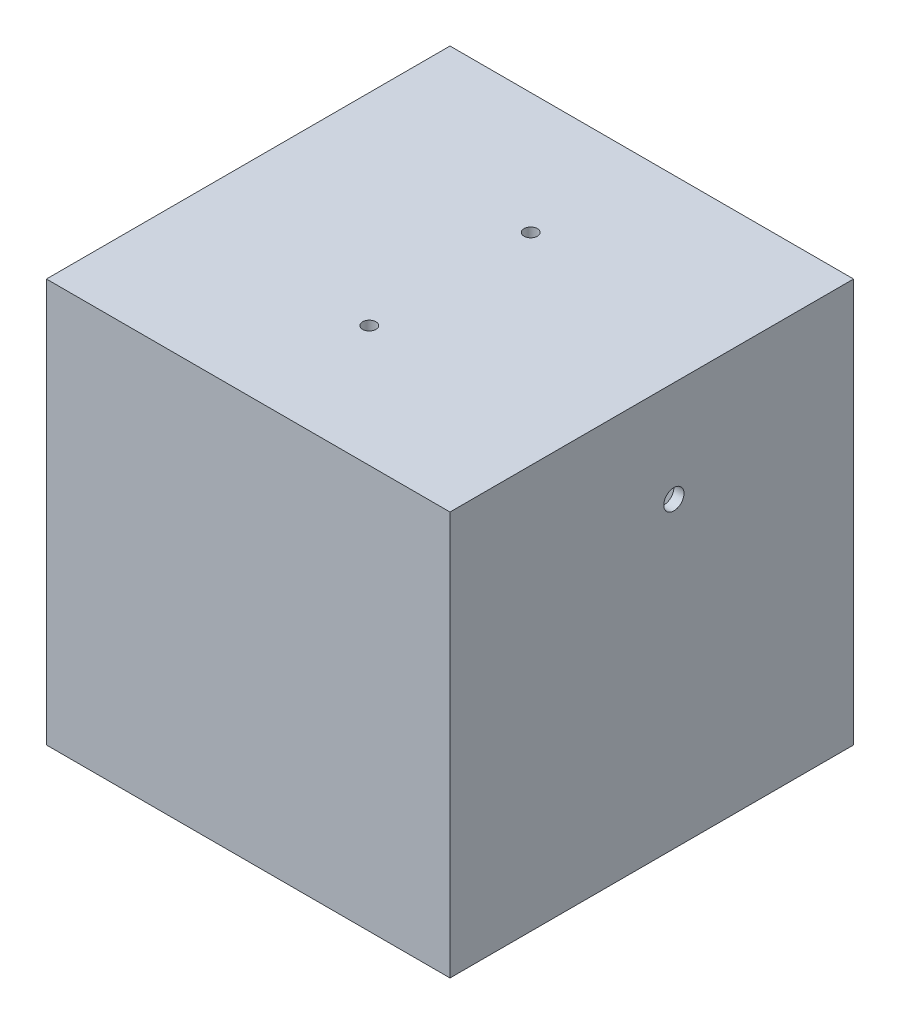
ISO-10303-21;
HEADER;
FILE_DESCRIPTION(('STEP AP214'),'2;1');
FILE_NAME('part.step','',(''),(''),'','','');
FILE_SCHEMA(('AUTOMOTIVE_DESIGN { 1 0 10303 214 1 1 1 1 }'));
ENDSEC;
DATA;
#1=APPLICATION_CONTEXT('core data for automotive mechanical design processes');
#2=APPLICATION_PROTOCOL_DEFINITION('international standard','automotive_design',2000,#1);
#3=PRODUCT_CONTEXT('',#1,'mechanical');
#4=PRODUCT('Part','Part','',(#3));
#5=PRODUCT_RELATED_PRODUCT_CATEGORY('part','',(#4));
#6=PRODUCT_DEFINITION_FORMATION('','',#4);
#7=PRODUCT_DEFINITION_CONTEXT('part definition',#1,'design');
#8=PRODUCT_DEFINITION('design','',#6,#7);
#9=PRODUCT_DEFINITION_SHAPE('','',#8);
#10=(LENGTH_UNIT() NAMED_UNIT(*) SI_UNIT(.MILLI.,.METRE.));
#11=(NAMED_UNIT(*) PLANE_ANGLE_UNIT() SI_UNIT($,.RADIAN.));
#12=(NAMED_UNIT(*) SI_UNIT($,.STERADIAN.) SOLID_ANGLE_UNIT());
#13=UNCERTAINTY_MEASURE_WITH_UNIT(LENGTH_MEASURE(1.E-05),#10,'distance_accuracy_value','');
#14=(GEOMETRIC_REPRESENTATION_CONTEXT(3) GLOBAL_UNCERTAINTY_ASSIGNED_CONTEXT((#13)) GLOBAL_UNIT_ASSIGNED_CONTEXT((#10,
#11,#12)) REPRESENTATION_CONTEXT('',''));
#15=CARTESIAN_POINT('',(0.,0.,0.));
#16=DIRECTION('',(0.,0.,1.));
#17=DIRECTION('',(1.,0.,0.));
#18=AXIS2_PLACEMENT_3D('',#15,#16,#17);
#19=CARTESIAN_POINT('',(0.,5.,0.));
#20=DIRECTION('',(1.,0.,0.));
#21=DIRECTION('',(0.,0.,-1.));
#22=AXIS2_PLACEMENT_3D('',#19,#20,#21);
#23=PLANE('',#22);
#24=CARTESIAN_POINT('',(0.,-45.,-110.95));
#25=DIRECTION('',(1.,0.,0.));
#26=DIRECTION('',(0.,0.,-1.));
#27=AXIS2_PLACEMENT_3D('',#24,#25,#26);
#28=CIRCLE('',#27,5.00000000000001);
#29=CARTESIAN_POINT('',(0.,-45.,-115.95));
#30=VERTEX_POINT('',#29);
#31=EDGE_CURVE('E228',#30,#30,#28,.T.);
#32=ORIENTED_EDGE('',*,*,#31,.T.);
#33=EDGE_LOOP('',(#32));
#34=FACE_BOUND('',#33,.T.);
#35=DIRECTION('',(0.,-1.,0.));
#36=VECTOR('',#35,1.);
#37=CARTESIAN_POINT('',(0.,5.,-200.));
#38=LINE('',#37,#36);
#39=CARTESIAN_POINT('',(0.,5.,-200.));
#40=VERTEX_POINT('',#39);
#41=CARTESIAN_POINT('',(0.,-195.,-200.));
#42=VERTEX_POINT('',#41);
#43=EDGE_CURVE('E102',#40,#42,#38,.T.);
#44=ORIENTED_EDGE('',*,*,#43,.T.);
#45=DIRECTION('',(0.,0.,-1.));
#46=VECTOR('',#45,1.);
#47=CARTESIAN_POINT('',(0.,-195.,0.));
#48=LINE('',#47,#46);
#49=CARTESIAN_POINT('',(0.,-195.,0.));
#50=VERTEX_POINT('',#49);
#51=EDGE_CURVE('E106',#50,#42,#48,.T.);
#52=ORIENTED_EDGE('',*,*,#51,.F.);
#53=DIRECTION('',(0.,-1.,0.));
#54=VECTOR('',#53,1.);
#55=CARTESIAN_POINT('',(0.,5.,0.));
#56=LINE('',#55,#54);
#57=CARTESIAN_POINT('',(0.,5.,0.));
#58=VERTEX_POINT('',#57);
#59=EDGE_CURVE('E11',#58,#50,#56,.T.);
#60=ORIENTED_EDGE('',*,*,#59,.F.);
#61=DIRECTION('',(0.,0.,1.));
#62=VECTOR('',#61,1.);
#63=CARTESIAN_POINT('',(0.,5.,0.));
#64=LINE('',#63,#62);
#65=EDGE_CURVE('E108',#40,#58,#64,.T.);
#66=ORIENTED_EDGE('',*,*,#65,.F.);
#67=EDGE_LOOP('',(#44,#52,#60,#66));
#68=FACE_BOUND('',#67,.T.);
#69=ADVANCED_FACE('F38',(#34,#68),#23,.F.);
#70=CARTESIAN_POINT('',(0.,5.,0.));
#71=DIRECTION('',(0.,0.,-1.));
#72=DIRECTION('',(-1.,0.,0.));
#73=AXIS2_PLACEMENT_3D('',#70,#71,#72);
#74=PLANE('',#73);
#75=ORIENTED_EDGE('',*,*,#59,.T.);
#76=DIRECTION('',(-1.,0.,0.));
#77=VECTOR('',#76,1.);
#78=CARTESIAN_POINT('',(0.,-195.,0.));
#79=LINE('',#78,#77);
#80=CARTESIAN_POINT('',(200.,-195.,0.));
#81=VERTEX_POINT('',#80);
#82=EDGE_CURVE('E129',#81,#50,#79,.T.);
#83=ORIENTED_EDGE('',*,*,#82,.F.);
#84=DIRECTION('',(0.,-1.,0.));
#85=VECTOR('',#84,1.);
#86=CARTESIAN_POINT('',(200.,5.,0.));
#87=LINE('',#86,#85);
#88=CARTESIAN_POINT('',(200.,5.,0.));
#89=VERTEX_POINT('',#88);
#90=EDGE_CURVE('E47',#89,#81,#87,.T.);
#91=ORIENTED_EDGE('',*,*,#90,.F.);
#92=DIRECTION('',(1.,0.,0.));
#93=VECTOR('',#92,1.);
#94=CARTESIAN_POINT('',(0.,5.,0.));
#95=LINE('',#94,#93);
#96=EDGE_CURVE('E186',#58,#89,#95,.T.);
#97=ORIENTED_EDGE('',*,*,#96,.F.);
#98=EDGE_LOOP('',(#75,#83,#91,#97));
#99=FACE_BOUND('',#98,.T.);
#100=ADVANCED_FACE('F202',(#99),#74,.F.);
#101=CARTESIAN_POINT('',(200.,5.,0.));
#102=DIRECTION('',(-1.,0.,0.));
#103=DIRECTION('',(0.,0.,1.));
#104=AXIS2_PLACEMENT_3D('',#101,#102,#103);
#105=PLANE('',#104);
#106=CARTESIAN_POINT('',(200.,-45.,-110.95));
#107=DIRECTION('',(1.,0.,0.));
#108=DIRECTION('',(0.,0.,-1.));
#109=AXIS2_PLACEMENT_3D('',#106,#107,#108);
#110=CIRCLE('',#109,5.00000000000001);
#111=CARTESIAN_POINT('',(200.,-45.,-115.95));
#112=VERTEX_POINT('',#111);
#113=EDGE_CURVE('E231',#112,#112,#110,.T.);
#114=ORIENTED_EDGE('',*,*,#113,.F.);
#115=EDGE_LOOP('',(#114));
#116=FACE_BOUND('',#115,.T.);
#117=ORIENTED_EDGE('',*,*,#90,.T.);
#118=DIRECTION('',(0.,0.,1.));
#119=VECTOR('',#118,1.);
#120=CARTESIAN_POINT('',(200.,-195.,0.));
#121=LINE('',#120,#119);
#122=CARTESIAN_POINT('',(200.,-195.,-200.));
#123=VERTEX_POINT('',#122);
#124=EDGE_CURVE('E123',#123,#81,#121,.T.);
#125=ORIENTED_EDGE('',*,*,#124,.F.);
#126=DIRECTION('',(0.,-1.,0.));
#127=VECTOR('',#126,1.);
#128=CARTESIAN_POINT('',(200.,5.,-200.));
#129=LINE('',#128,#127);
#130=CARTESIAN_POINT('',(200.,5.,-200.));
#131=VERTEX_POINT('',#130);
#132=EDGE_CURVE('E112',#131,#123,#129,.T.);
#133=ORIENTED_EDGE('',*,*,#132,.F.);
#134=DIRECTION('',(0.,0.,-1.));
#135=VECTOR('',#134,1.);
#136=CARTESIAN_POINT('',(200.,5.,0.));
#137=LINE('',#136,#135);
#138=EDGE_CURVE('E189',#89,#131,#137,.T.);
#139=ORIENTED_EDGE('',*,*,#138,.F.);
#140=EDGE_LOOP('',(#117,#125,#133,#139));
#141=FACE_BOUND('',#140,.T.);
#142=ADVANCED_FACE('F200',(#116,#141),#105,.F.);
#143=CARTESIAN_POINT('',(0.,5.,-200.));
#144=DIRECTION('',(0.,0.,1.));
#145=DIRECTION('',(1.,0.,0.));
#146=AXIS2_PLACEMENT_3D('',#143,#144,#145);
#147=PLANE('',#146);
#148=ORIENTED_EDGE('',*,*,#132,.T.);
#149=DIRECTION('',(1.,0.,0.));
#150=VECTOR('',#149,1.);
#151=CARTESIAN_POINT('',(0.,-195.,-200.));
#152=LINE('',#151,#150);
#153=EDGE_CURVE('E116',#42,#123,#152,.T.);
#154=ORIENTED_EDGE('',*,*,#153,.F.);
#155=ORIENTED_EDGE('',*,*,#43,.F.);
#156=DIRECTION('',(-1.,0.,0.));
#157=VECTOR('',#156,1.);
#158=CARTESIAN_POINT('',(0.,5.,-200.));
#159=LINE('',#158,#157);
#160=EDGE_CURVE('E113',#131,#40,#159,.T.);
#161=ORIENTED_EDGE('',*,*,#160,.F.);
#162=EDGE_LOOP('',(#148,#154,#155,#161));
#163=FACE_BOUND('',#162,.T.);
#164=ADVANCED_FACE('F117',(#163),#147,.F.);
#165=CARTESIAN_POINT('',(0.,5.,0.));
#166=DIRECTION('',(0.,-1.,0.));
#167=DIRECTION('',(0.,0.,-1.));
#168=AXIS2_PLACEMENT_3D('',#165,#166,#167);
#169=PLANE('',#168);
#170=CARTESIAN_POINT('',(100.,5.,-140.));
#171=DIRECTION('',(0.,1.,0.));
#172=DIRECTION('',(0.,0.,1.));
#173=AXIS2_PLACEMENT_3D('',#170,#171,#172);
#174=CIRCLE('',#173,3.3);
#175=CARTESIAN_POINT('',(100.,5.,-136.7));
#176=VERTEX_POINT('',#175);
#177=EDGE_CURVE('E248',#176,#176,#174,.T.);
#178=ORIENTED_EDGE('',*,*,#177,.F.);
#179=EDGE_LOOP('',(#178));
#180=FACE_BOUND('',#179,.T.);
#181=CARTESIAN_POINT('',(100.,5.,-60.));
#182=DIRECTION('',(0.,1.,0.));
#183=DIRECTION('',(0.,0.,-1.));
#184=AXIS2_PLACEMENT_3D('',#181,#182,#183);
#185=CIRCLE('',#184,3.3);
#186=CARTESIAN_POINT('',(100.,5.,-63.3));
#187=VERTEX_POINT('',#186);
#188=EDGE_CURVE('E243',#187,#187,#185,.T.);
#189=ORIENTED_EDGE('',*,*,#188,.F.);
#190=EDGE_LOOP('',(#189));
#191=FACE_BOUND('',#190,.T.);
#192=ORIENTED_EDGE('',*,*,#65,.T.);
#193=ORIENTED_EDGE('',*,*,#96,.T.);
#194=ORIENTED_EDGE('',*,*,#138,.T.);
#195=ORIENTED_EDGE('',*,*,#160,.T.);
#196=EDGE_LOOP('',(#192,#193,#194,#195));
#197=FACE_BOUND('',#196,.T.);
#198=ADVANCED_FACE('F204',(#180,#191,#197),#169,.F.);
#199=CARTESIAN_POINT('',(0.,-195.,0.));
#200=DIRECTION('',(0.,-1.,0.));
#201=DIRECTION('',(0.,0.,-1.));
#202=AXIS2_PLACEMENT_3D('',#199,#200,#201);
#203=PLANE('',#202);
#204=ORIENTED_EDGE('',*,*,#51,.T.);
#205=ORIENTED_EDGE('',*,*,#153,.T.);
#206=ORIENTED_EDGE('',*,*,#124,.T.);
#207=ORIENTED_EDGE('',*,*,#82,.T.);
#208=EDGE_LOOP('',(#204,#205,#206,#207));
#209=FACE_BOUND('',#208,.T.);
#210=CARTESIAN_POINT('',(100.,-195.,-100.));
#211=DIRECTION('',(0.,-1.,0.));
#212=DIRECTION('',(0.,0.,-1.));
#213=AXIS2_PLACEMENT_3D('',#210,#211,#212);
#214=CIRCLE('',#213,70.);
#215=CARTESIAN_POINT('',(100.,-195.,-170.));
#216=VERTEX_POINT('',#215);
#217=EDGE_CURVE('E131',#216,#216,#214,.T.);
#218=ORIENTED_EDGE('',*,*,#217,.F.);
#219=EDGE_LOOP('',(#218));
#220=FACE_BOUND('',#219,.T.);
#221=ADVANCED_FACE('F126',(#209,#220),#203,.T.);
#222=CARTESIAN_POINT('',(0.,-190.,0.));
#223=DIRECTION('',(0.,-1.,0.));
#224=DIRECTION('',(0.,0.,-1.));
#225=AXIS2_PLACEMENT_3D('',#222,#223,#224);
#226=PLANE('',#225);
#227=DIRECTION('',(0.,0.,1.));
#228=VECTOR('',#227,1.);
#229=CARTESIAN_POINT('',(195.,-190.,-5.));
#230=LINE('',#229,#228);
#231=CARTESIAN_POINT('',(195.,-190.,-195.));
#232=VERTEX_POINT('',#231);
#233=CARTESIAN_POINT('',(195.,-190.,-5.));
#234=VERTEX_POINT('',#233);
#235=EDGE_CURVE('E143',#232,#234,#230,.T.);
#236=ORIENTED_EDGE('',*,*,#235,.F.);
#237=DIRECTION('',(1.,0.,0.));
#238=VECTOR('',#237,1.);
#239=CARTESIAN_POINT('',(5.00000000000002,-190.,-195.));
#240=LINE('',#239,#238);
#241=CARTESIAN_POINT('',(5.00000000000002,-190.,-195.));
#242=VERTEX_POINT('',#241);
#243=EDGE_CURVE('E156',#242,#232,#240,.T.);
#244=ORIENTED_EDGE('',*,*,#243,.F.);
#245=DIRECTION('',(0.,0.,-1.));
#246=VECTOR('',#245,1.);
#247=CARTESIAN_POINT('',(5.00000000000002,-190.,-5.));
#248=LINE('',#247,#246);
#249=CARTESIAN_POINT('',(5.00000000000002,-190.,-5.));
#250=VERTEX_POINT('',#249);
#251=EDGE_CURVE('E152',#250,#242,#248,.T.);
#252=ORIENTED_EDGE('',*,*,#251,.F.);
#253=DIRECTION('',(-1.,0.,0.));
#254=VECTOR('',#253,1.);
#255=CARTESIAN_POINT('',(5.00000000000002,-190.,-5.));
#256=LINE('',#255,#254);
#257=EDGE_CURVE('E147',#234,#250,#256,.T.);
#258=ORIENTED_EDGE('',*,*,#257,.F.);
#259=EDGE_LOOP('',(#236,#244,#252,#258));
#260=FACE_BOUND('',#259,.T.);
#261=CARTESIAN_POINT('',(100.,-190.,-100.));
#262=DIRECTION('',(0.,-1.,0.));
#263=DIRECTION('',(0.,0.,-1.));
#264=AXIS2_PLACEMENT_3D('',#261,#262,#263);
#265=CIRCLE('',#264,70.);
#266=CARTESIAN_POINT('',(100.,-190.,-170.));
#267=VERTEX_POINT('',#266);
#268=EDGE_CURVE('E135',#267,#267,#265,.T.);
#269=ORIENTED_EDGE('',*,*,#268,.T.);
#270=EDGE_LOOP('',(#269));
#271=FACE_BOUND('',#270,.T.);
#272=ADVANCED_FACE('F212',(#260,#271),#226,.F.);
#273=CARTESIAN_POINT('',(100.,-195.,-100.));
#274=DIRECTION('',(0.,1.,0.));
#275=DIRECTION('',(0.,0.,1.));
#276=AXIS2_PLACEMENT_3D('',#273,#274,#275);
#277=CYLINDRICAL_SURFACE('',#276,70.);
#278=ORIENTED_EDGE('',*,*,#217,.T.);
#279=EDGE_LOOP('',(#278));
#280=FACE_BOUND('',#279,.T.);
#281=ORIENTED_EDGE('',*,*,#268,.F.);
#282=EDGE_LOOP('',(#281));
#283=FACE_BOUND('',#282,.T.);
#284=ADVANCED_FACE('F279',(#280,#283),#277,.F.);
#285=CARTESIAN_POINT('',(0.,0.,0.));
#286=DIRECTION('',(0.,-1.,0.));
#287=DIRECTION('',(0.,0.,-1.));
#288=AXIS2_PLACEMENT_3D('',#285,#286,#287);
#289=PLANE('',#288);
#290=CARTESIAN_POINT('',(100.,0.,-140.));
#291=DIRECTION('',(0.,1.,0.));
#292=DIRECTION('',(0.,0.,1.));
#293=AXIS2_PLACEMENT_3D('',#290,#291,#292);
#294=CIRCLE('',#293,3.3);
#295=CARTESIAN_POINT('',(100.,0.,-136.7));
#296=VERTEX_POINT('',#295);
#297=EDGE_CURVE('E244',#296,#296,#294,.T.);
#298=ORIENTED_EDGE('',*,*,#297,.T.);
#299=EDGE_LOOP('',(#298));
#300=FACE_BOUND('',#299,.T.);
#301=CARTESIAN_POINT('',(100.,0.,-60.));
#302=DIRECTION('',(0.,1.,0.));
#303=DIRECTION('',(0.,0.,-1.));
#304=AXIS2_PLACEMENT_3D('',#301,#302,#303);
#305=CIRCLE('',#304,3.3);
#306=CARTESIAN_POINT('',(100.,0.,-63.3));
#307=VERTEX_POINT('',#306);
#308=EDGE_CURVE('E252',#307,#307,#305,.T.);
#309=ORIENTED_EDGE('',*,*,#308,.T.);
#310=EDGE_LOOP('',(#309));
#311=FACE_BOUND('',#310,.T.);
#312=DIRECTION('',(0.,0.,1.));
#313=VECTOR('',#312,1.);
#314=CARTESIAN_POINT('',(195.,0.,-5.));
#315=LINE('',#314,#313);
#316=CARTESIAN_POINT('',(195.,0.,-195.));
#317=VERTEX_POINT('',#316);
#318=CARTESIAN_POINT('',(195.,0.,-5.));
#319=VERTEX_POINT('',#318);
#320=EDGE_CURVE('E54',#317,#319,#315,.T.);
#321=ORIENTED_EDGE('',*,*,#320,.T.);
#322=DIRECTION('',(-1.,0.,0.));
#323=VECTOR('',#322,1.);
#324=CARTESIAN_POINT('',(5.00000000000002,0.,-5.));
#325=LINE('',#324,#323);
#326=CARTESIAN_POINT('',(5.00000000000002,0.,-5.));
#327=VERTEX_POINT('',#326);
#328=EDGE_CURVE('E58',#319,#327,#325,.T.);
#329=ORIENTED_EDGE('',*,*,#328,.T.);
#330=DIRECTION('',(0.,0.,-1.));
#331=VECTOR('',#330,1.);
#332=CARTESIAN_POINT('',(5.00000000000002,0.,-5.));
#333=LINE('',#332,#331);
#334=CARTESIAN_POINT('',(5.00000000000002,0.,-195.));
#335=VERTEX_POINT('',#334);
#336=EDGE_CURVE('E165',#327,#335,#333,.T.);
#337=ORIENTED_EDGE('',*,*,#336,.T.);
#338=DIRECTION('',(1.,0.,0.));
#339=VECTOR('',#338,1.);
#340=CARTESIAN_POINT('',(5.00000000000002,0.,-195.));
#341=LINE('',#340,#339);
#342=EDGE_CURVE('E148',#335,#317,#341,.T.);
#343=ORIENTED_EDGE('',*,*,#342,.T.);
#344=EDGE_LOOP('',(#321,#329,#337,#343));
#345=FACE_BOUND('',#344,.T.);
#346=ADVANCED_FACE('F281',(#300,#311,#345),#289,.T.);
#347=CARTESIAN_POINT('',(5.00000000000002,-190.,-5.));
#348=DIRECTION('',(0.,0.,-1.));
#349=DIRECTION('',(-1.,0.,0.));
#350=AXIS2_PLACEMENT_3D('',#347,#348,#349);
#351=PLANE('',#350);
#352=ORIENTED_EDGE('',*,*,#328,.F.);
#353=DIRECTION('',(0.,1.,0.));
#354=VECTOR('',#353,1.);
#355=CARTESIAN_POINT('',(195.,-190.,-5.));
#356=LINE('',#355,#354);
#357=EDGE_CURVE('E180',#234,#319,#356,.T.);
#358=ORIENTED_EDGE('',*,*,#357,.F.);
#359=ORIENTED_EDGE('',*,*,#257,.T.);
#360=DIRECTION('',(0.,1.,0.));
#361=VECTOR('',#360,1.);
#362=CARTESIAN_POINT('',(5.00000000000002,-190.,-5.));
#363=LINE('',#362,#361);
#364=EDGE_CURVE('E177',#250,#327,#363,.T.);
#365=ORIENTED_EDGE('',*,*,#364,.T.);
#366=EDGE_LOOP('',(#352,#358,#359,#365));
#367=FACE_BOUND('',#366,.T.);
#368=ADVANCED_FACE('F293',(#367),#351,.T.);
#369=CARTESIAN_POINT('',(5.00000000000002,-190.,-5.));
#370=DIRECTION('',(1.,0.,0.));
#371=DIRECTION('',(0.,0.,-1.));
#372=AXIS2_PLACEMENT_3D('',#369,#370,#371);
#373=PLANE('',#372);
#374=CARTESIAN_POINT('',(5.00000000000002,-45.,-110.95));
#375=DIRECTION('',(1.,0.,0.));
#376=DIRECTION('',(0.,0.,-1.));
#377=AXIS2_PLACEMENT_3D('',#374,#375,#376);
#378=CIRCLE('',#377,5.00000000000001);
#379=CARTESIAN_POINT('',(5.00000000000002,-45.,-115.95));
#380=VERTEX_POINT('',#379);
#381=EDGE_CURVE('E236',#380,#380,#378,.T.);
#382=ORIENTED_EDGE('',*,*,#381,.F.);
#383=EDGE_LOOP('',(#382));
#384=FACE_BOUND('',#383,.T.);
#385=ORIENTED_EDGE('',*,*,#336,.F.);
#386=ORIENTED_EDGE('',*,*,#364,.F.);
#387=ORIENTED_EDGE('',*,*,#251,.T.);
#388=DIRECTION('',(0.,1.,0.));
#389=VECTOR('',#388,1.);
#390=CARTESIAN_POINT('',(5.00000000000002,-190.,-195.));
#391=LINE('',#390,#389);
#392=EDGE_CURVE('E173',#242,#335,#391,.T.);
#393=ORIENTED_EDGE('',*,*,#392,.T.);
#394=EDGE_LOOP('',(#385,#386,#387,#393));
#395=FACE_BOUND('',#394,.T.);
#396=ADVANCED_FACE('F289',(#384,#395),#373,.T.);
#397=CARTESIAN_POINT('',(5.00000000000002,-190.,-195.));
#398=DIRECTION('',(0.,0.,1.));
#399=DIRECTION('',(1.,0.,0.));
#400=AXIS2_PLACEMENT_3D('',#397,#398,#399);
#401=PLANE('',#400);
#402=ORIENTED_EDGE('',*,*,#342,.F.);
#403=ORIENTED_EDGE('',*,*,#392,.F.);
#404=ORIENTED_EDGE('',*,*,#243,.T.);
#405=DIRECTION('',(0.,1.,0.));
#406=VECTOR('',#405,1.);
#407=CARTESIAN_POINT('',(195.,-190.,-195.));
#408=LINE('',#407,#406);
#409=EDGE_CURVE('E160',#232,#317,#408,.T.);
#410=ORIENTED_EDGE('',*,*,#409,.T.);
#411=EDGE_LOOP('',(#402,#403,#404,#410));
#412=FACE_BOUND('',#411,.T.);
#413=ADVANCED_FACE('F274',(#412),#401,.T.);
#414=CARTESIAN_POINT('',(195.,-190.,-5.));
#415=DIRECTION('',(-1.,0.,0.));
#416=DIRECTION('',(0.,0.,1.));
#417=AXIS2_PLACEMENT_3D('',#414,#415,#416);
#418=PLANE('',#417);
#419=CARTESIAN_POINT('',(195.,-45.,-110.95));
#420=DIRECTION('',(-1.,0.,0.));
#421=DIRECTION('',(0.,0.,1.));
#422=AXIS2_PLACEMENT_3D('',#419,#420,#421);
#423=CIRCLE('',#422,5.00000000000001);
#424=CARTESIAN_POINT('',(195.,-45.,-105.95));
#425=VERTEX_POINT('',#424);
#426=EDGE_CURVE('E41',#425,#425,#423,.T.);
#427=ORIENTED_EDGE('',*,*,#426,.F.);
#428=EDGE_LOOP('',(#427));
#429=FACE_BOUND('',#428,.T.);
#430=ORIENTED_EDGE('',*,*,#320,.F.);
#431=ORIENTED_EDGE('',*,*,#409,.F.);
#432=ORIENTED_EDGE('',*,*,#235,.T.);
#433=ORIENTED_EDGE('',*,*,#357,.T.);
#434=EDGE_LOOP('',(#430,#431,#432,#433));
#435=FACE_BOUND('',#434,.T.);
#436=ADVANCED_FACE('F263',(#429,#435),#418,.T.);
#437=CARTESIAN_POINT('',(100.,0.,-60.));
#438=DIRECTION('',(0.,1.,0.));
#439=DIRECTION('',(0.,0.,1.));
#440=AXIS2_PLACEMENT_3D('',#437,#438,#439);
#441=CYLINDRICAL_SURFACE('',#440,3.3);
#442=ORIENTED_EDGE('',*,*,#308,.F.);
#443=EDGE_LOOP('',(#442));
#444=FACE_BOUND('',#443,.T.);
#445=ORIENTED_EDGE('',*,*,#188,.T.);
#446=EDGE_LOOP('',(#445));
#447=FACE_BOUND('',#446,.T.);
#448=ADVANCED_FACE('F260',(#444,#447),#441,.F.);
#449=CARTESIAN_POINT('',(100.,0.,-140.));
#450=DIRECTION('',(0.,1.,0.));
#451=DIRECTION('',(0.,0.,1.));
#452=AXIS2_PLACEMENT_3D('',#449,#450,#451);
#453=CYLINDRICAL_SURFACE('',#452,3.3);
#454=ORIENTED_EDGE('',*,*,#297,.F.);
#455=EDGE_LOOP('',(#454));
#456=FACE_BOUND('',#455,.T.);
#457=ORIENTED_EDGE('',*,*,#177,.T.);
#458=EDGE_LOOP('',(#457));
#459=FACE_BOUND('',#458,.T.);
#460=ADVANCED_FACE('F262',(#456,#459),#453,.F.);
#461=CARTESIAN_POINT('',(0.,-45.,-110.95));
#462=DIRECTION('',(1.,0.,0.));
#463=DIRECTION('',(0.,0.,-1.));
#464=AXIS2_PLACEMENT_3D('',#461,#462,#463);
#465=CYLINDRICAL_SURFACE('',#464,5.00000000000001);
#466=ORIENTED_EDGE('',*,*,#426,.T.);
#467=EDGE_LOOP('',(#466));
#468=FACE_BOUND('',#467,.T.);
#469=ORIENTED_EDGE('',*,*,#113,.T.);
#470=EDGE_LOOP('',(#469));
#471=FACE_BOUND('',#470,.T.);
#472=ADVANCED_FACE('F270',(#468,#471),#465,.F.);
#473=ORIENTED_EDGE('',*,*,#381,.T.);
#474=EDGE_LOOP('',(#473));
#475=FACE_BOUND('',#474,.T.);
#476=ORIENTED_EDGE('',*,*,#31,.F.);
#477=EDGE_LOOP('',(#476));
#478=FACE_BOUND('',#477,.T.);
#479=ADVANCED_FACE('F325',(#475,#478),#465,.F.);
#480=CLOSED_SHELL('',(#69,#100,#142,#164,#198,#221,#272,#284,#346,#368,#396,#413,#436,#448,#460,
#472,#479));
#481=MANIFOLD_SOLID_BREP('B2',#480);
#482=ADVANCED_BREP_SHAPE_REPRESENTATION('',(#18,#481),#14);
#483=SHAPE_DEFINITION_REPRESENTATION(#9,#482);
ENDSEC;
END-ISO-10303-21;
